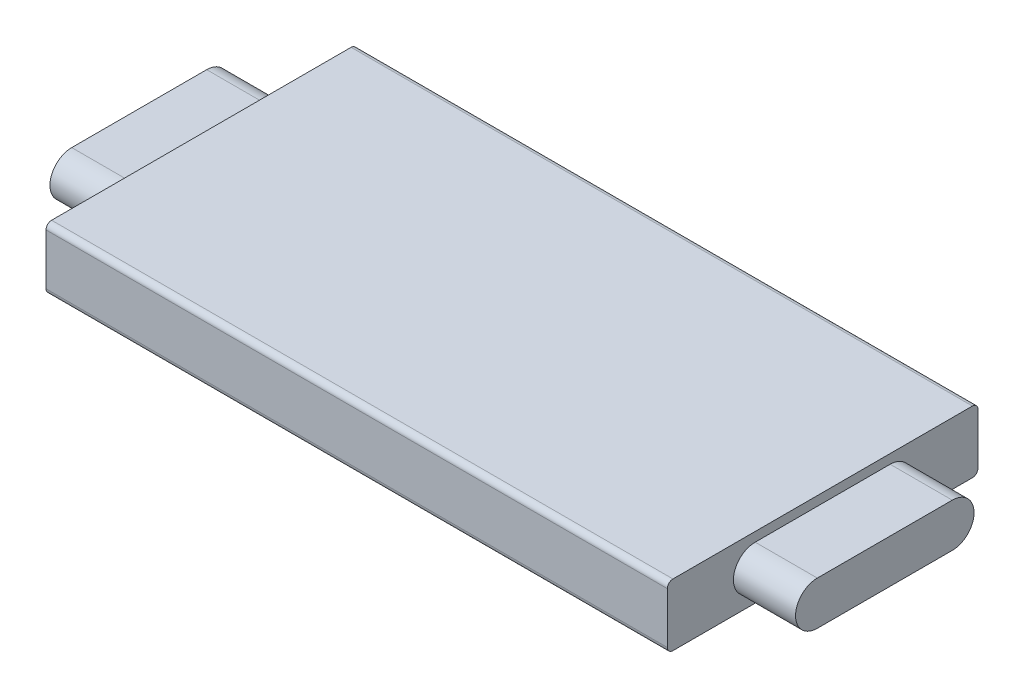
ISO-10303-21;
HEADER;
FILE_DESCRIPTION(('STEP AP214'),'2;1');
FILE_NAME('part.step','',(''),(''),'','','');
FILE_SCHEMA(('AUTOMOTIVE_DESIGN { 1 0 10303 214 1 1 1 1 }'));
ENDSEC;
DATA;
#1=APPLICATION_CONTEXT('core data for automotive mechanical design processes');
#2=APPLICATION_PROTOCOL_DEFINITION('international standard','automotive_design',2000,#1);
#3=PRODUCT_CONTEXT('',#1,'mechanical');
#4=PRODUCT('Part','Part','',(#3));
#5=PRODUCT_RELATED_PRODUCT_CATEGORY('part','',(#4));
#6=PRODUCT_DEFINITION_FORMATION('','',#4);
#7=PRODUCT_DEFINITION_CONTEXT('part definition',#1,'design');
#8=PRODUCT_DEFINITION('design','',#6,#7);
#9=PRODUCT_DEFINITION_SHAPE('','',#8);
#10=(LENGTH_UNIT() NAMED_UNIT(*) SI_UNIT(.MILLI.,.METRE.));
#11=(NAMED_UNIT(*) PLANE_ANGLE_UNIT() SI_UNIT($,.RADIAN.));
#12=(NAMED_UNIT(*) SI_UNIT($,.STERADIAN.) SOLID_ANGLE_UNIT());
#13=UNCERTAINTY_MEASURE_WITH_UNIT(LENGTH_MEASURE(1.E-05),#10,'distance_accuracy_value','');
#14=(GEOMETRIC_REPRESENTATION_CONTEXT(3) GLOBAL_UNCERTAINTY_ASSIGNED_CONTEXT((#13)) GLOBAL_UNIT_ASSIGNED_CONTEXT((#10,
#11,#12)) REPRESENTATION_CONTEXT('',''));
#15=CARTESIAN_POINT('',(0.,0.,0.));
#16=DIRECTION('',(0.,0.,1.));
#17=DIRECTION('',(1.,0.,0.));
#18=AXIS2_PLACEMENT_3D('',#15,#16,#17);
#19=CARTESIAN_POINT('',(12.7,1.27,6.35));
#20=DIRECTION('',(-1.,0.,0.));
#21=DIRECTION('',(0.,0.,1.));
#22=AXIS2_PLACEMENT_3D('',#19,#20,#21);
#23=PLANE('',#22);
#24=DIRECTION('',(0.,0.,1.));
#25=VECTOR('',#24,1.);
#26=CARTESIAN_POINT('',(12.7,-0.890155408524717,6.35));
#27=LINE('',#26,#25);
#28=CARTESIAN_POINT('',(12.7,-0.890155408524717,-2.75846638002906));
#29=VERTEX_POINT('',#28);
#30=CARTESIAN_POINT('',(12.7,-0.890155408524717,2.75846638002906));
#31=VERTEX_POINT('',#30);
#32=EDGE_CURVE('E218',#29,#31,#27,.T.);
#33=ORIENTED_EDGE('',*,*,#32,.T.);
#34=CARTESIAN_POINT('',(12.7,0.,2.75846638002906));
#35=DIRECTION('',(-1.,0.,0.));
#36=DIRECTION('',(0.,0.,1.));
#37=AXIS2_PLACEMENT_3D('',#34,#35,#36);
#38=CIRCLE('',#37,0.890155408524717);
#39=CARTESIAN_POINT('',(12.7,0.890155408524717,2.75846638002906));
#40=VERTEX_POINT('',#39);
#41=EDGE_CURVE('E229',#31,#40,#38,.T.);
#42=ORIENTED_EDGE('',*,*,#41,.T.);
#43=DIRECTION('',(0.,0.,-1.));
#44=VECTOR('',#43,1.);
#45=CARTESIAN_POINT('',(12.7,0.890155408524717,6.35));
#46=LINE('',#45,#44);
#47=CARTESIAN_POINT('',(12.7,0.890155408524717,-2.75846638002906));
#48=VERTEX_POINT('',#47);
#49=EDGE_CURVE('E223',#40,#48,#46,.T.);
#50=ORIENTED_EDGE('',*,*,#49,.T.);
#51=CARTESIAN_POINT('',(12.7,0.,-2.75846638002906));
#52=DIRECTION('',(-1.,0.,0.));
#53=DIRECTION('',(0.,0.,1.));
#54=AXIS2_PLACEMENT_3D('',#51,#52,#53);
#55=CIRCLE('',#54,0.890155408524717);
#56=EDGE_CURVE('E169',#48,#29,#55,.T.);
#57=ORIENTED_EDGE('',*,*,#56,.T.);
#58=EDGE_LOOP('',(#33,#42,#50,#57));
#59=FACE_BOUND('',#58,.T.);
#60=DIRECTION('',(0.,0.,-1.));
#61=VECTOR('',#60,1.);
#62=CARTESIAN_POINT('',(12.7,-1.27,6.35));
#63=LINE('',#62,#61);
#64=CARTESIAN_POINT('',(12.7,-1.27,6.1214));
#65=VERTEX_POINT('',#64);
#66=CARTESIAN_POINT('',(12.7,-1.27,-6.1214));
#67=VERTEX_POINT('',#66);
#68=EDGE_CURVE('E235',#65,#67,#63,.T.);
#69=ORIENTED_EDGE('',*,*,#68,.T.);
#70=CARTESIAN_POINT('',(12.7,-1.0414,-6.1214));
#71=DIRECTION('',(-1.,0.,0.));
#72=DIRECTION('',(0.,0.,1.));
#73=AXIS2_PLACEMENT_3D('',#70,#71,#72);
#74=CIRCLE('',#73,0.2286);
#75=CARTESIAN_POINT('',(12.7,-1.0414,-6.35));
#76=VERTEX_POINT('',#75);
#77=EDGE_CURVE('E299',#67,#76,#74,.F.);
#78=ORIENTED_EDGE('',*,*,#77,.T.);
#79=DIRECTION('',(0.,-1.,0.));
#80=VECTOR('',#79,1.);
#81=CARTESIAN_POINT('',(12.7,1.27,-6.35));
#82=LINE('',#81,#80);
#83=CARTESIAN_POINT('',(12.7,1.0414,-6.35));
#84=VERTEX_POINT('',#83);
#85=EDGE_CURVE('E257',#84,#76,#82,.T.);
#86=ORIENTED_EDGE('',*,*,#85,.F.);
#87=CARTESIAN_POINT('',(12.7,1.0414,-6.1214));
#88=DIRECTION('',(-1.,0.,0.));
#89=DIRECTION('',(0.,0.,1.));
#90=AXIS2_PLACEMENT_3D('',#87,#88,#89);
#91=CIRCLE('',#90,0.2286);
#92=CARTESIAN_POINT('',(12.7,1.27,-6.1214));
#93=VERTEX_POINT('',#92);
#94=EDGE_CURVE('E293',#84,#93,#91,.F.);
#95=ORIENTED_EDGE('',*,*,#94,.T.);
#96=DIRECTION('',(0.,0.,-1.));
#97=VECTOR('',#96,1.);
#98=CARTESIAN_POINT('',(12.7,1.27,6.35));
#99=LINE('',#98,#97);
#100=CARTESIAN_POINT('',(12.7,1.27,6.1214));
#101=VERTEX_POINT('',#100);
#102=EDGE_CURVE('E234',#101,#93,#99,.T.);
#103=ORIENTED_EDGE('',*,*,#102,.F.);
#104=CARTESIAN_POINT('',(12.7,1.0414,6.1214));
#105=DIRECTION('',(-1.,0.,0.));
#106=DIRECTION('',(0.,0.,1.));
#107=AXIS2_PLACEMENT_3D('',#104,#105,#106);
#108=CIRCLE('',#107,0.2286);
#109=CARTESIAN_POINT('',(12.7,1.0414,6.35));
#110=VERTEX_POINT('',#109);
#111=EDGE_CURVE('E286',#101,#110,#108,.F.);
#112=ORIENTED_EDGE('',*,*,#111,.T.);
#113=DIRECTION('',(0.,-1.,0.));
#114=VECTOR('',#113,1.);
#115=CARTESIAN_POINT('',(12.7,1.27,6.35));
#116=LINE('',#115,#114);
#117=CARTESIAN_POINT('',(12.7,-1.0414,6.35));
#118=VERTEX_POINT('',#117);
#119=EDGE_CURVE('E242',#110,#118,#116,.T.);
#120=ORIENTED_EDGE('',*,*,#119,.T.);
#121=CARTESIAN_POINT('',(12.7,-1.0414,6.1214));
#122=DIRECTION('',(-1.,0.,0.));
#123=DIRECTION('',(0.,0.,1.));
#124=AXIS2_PLACEMENT_3D('',#121,#122,#123);
#125=CIRCLE('',#124,0.2286);
#126=EDGE_CURVE('E295',#118,#65,#125,.F.);
#127=ORIENTED_EDGE('',*,*,#126,.T.);
#128=EDGE_LOOP('',(#69,#78,#86,#95,#103,#112,#120,#127));
#129=FACE_BOUND('',#128,.T.);
#130=ADVANCED_FACE('F50',(#59,#129),#23,.F.);
#131=CARTESIAN_POINT('',(-12.7,1.27,-6.35));
#132=DIRECTION('',(0.,0.,1.));
#133=DIRECTION('',(1.,0.,0.));
#134=AXIS2_PLACEMENT_3D('',#131,#132,#133);
#135=PLANE('',#134);
#136=ORIENTED_EDGE('',*,*,#85,.T.);
#137=DIRECTION('',(-1.,0.,0.));
#138=VECTOR('',#137,1.);
#139=CARTESIAN_POINT('',(-12.7,-1.0414,-6.35));
#140=LINE('',#139,#138);
#141=CARTESIAN_POINT('',(-12.7,-1.0414,-6.35));
#142=VERTEX_POINT('',#141);
#143=EDGE_CURVE('E270',#76,#142,#140,.T.);
#144=ORIENTED_EDGE('',*,*,#143,.T.);
#145=DIRECTION('',(0.,-1.,0.));
#146=VECTOR('',#145,1.);
#147=CARTESIAN_POINT('',(-12.7,1.27,-6.35));
#148=LINE('',#147,#146);
#149=CARTESIAN_POINT('',(-12.7,1.0414,-6.35));
#150=VERTEX_POINT('',#149);
#151=EDGE_CURVE('E258',#150,#142,#148,.T.);
#152=ORIENTED_EDGE('',*,*,#151,.F.);
#153=DIRECTION('',(-1.,0.,0.));
#154=VECTOR('',#153,1.);
#155=CARTESIAN_POINT('',(-12.7,1.0414,-6.35));
#156=LINE('',#155,#154);
#157=EDGE_CURVE('E262',#150,#84,#156,.F.);
#158=ORIENTED_EDGE('',*,*,#157,.T.);
#159=EDGE_LOOP('',(#136,#144,#152,#158));
#160=FACE_BOUND('',#159,.T.);
#161=ADVANCED_FACE('F355',(#160),#135,.F.);
#162=CARTESIAN_POINT('',(-12.7,1.27,6.35));
#163=DIRECTION('',(1.,0.,0.));
#164=DIRECTION('',(0.,0.,-1.));
#165=AXIS2_PLACEMENT_3D('',#162,#163,#164);
#166=PLANE('',#165);
#167=DIRECTION('',(0.,0.,1.));
#168=VECTOR('',#167,1.);
#169=CARTESIAN_POINT('',(-12.7,0.890155408524717,6.35));
#170=LINE('',#169,#168);
#171=CARTESIAN_POINT('',(-12.7,0.890155408524717,-2.75846638002906));
#172=VERTEX_POINT('',#171);
#173=CARTESIAN_POINT('',(-12.7,0.890155408524717,2.75846638002906));
#174=VERTEX_POINT('',#173);
#175=EDGE_CURVE('E57',#172,#174,#170,.T.);
#176=ORIENTED_EDGE('',*,*,#175,.T.);
#177=CARTESIAN_POINT('',(-12.7,0.,2.75846638002906));
#178=DIRECTION('',(1.,0.,0.));
#179=DIRECTION('',(0.,0.,-1.));
#180=AXIS2_PLACEMENT_3D('',#177,#178,#179);
#181=CIRCLE('',#180,0.890155408524717);
#182=CARTESIAN_POINT('',(-12.7,-0.890155408524717,2.75846638002906));
#183=VERTEX_POINT('',#182);
#184=EDGE_CURVE('E12',#174,#183,#181,.T.);
#185=ORIENTED_EDGE('',*,*,#184,.T.);
#186=DIRECTION('',(0.,0.,-1.));
#187=VECTOR('',#186,1.);
#188=CARTESIAN_POINT('',(-12.7,-0.890155408524717,6.35));
#189=LINE('',#188,#187);
#190=CARTESIAN_POINT('',(-12.7,-0.890155408524717,-2.75846638002906));
#191=VERTEX_POINT('',#190);
#192=EDGE_CURVE('E316',#183,#191,#189,.T.);
#193=ORIENTED_EDGE('',*,*,#192,.T.);
#194=CARTESIAN_POINT('',(-12.7,0.,-2.75846638002906));
#195=DIRECTION('',(1.,0.,0.));
#196=DIRECTION('',(0.,0.,-1.));
#197=AXIS2_PLACEMENT_3D('',#194,#195,#196);
#198=CIRCLE('',#197,0.890155408524717);
#199=EDGE_CURVE('E319',#191,#172,#198,.T.);
#200=ORIENTED_EDGE('',*,*,#199,.T.);
#201=EDGE_LOOP('',(#176,#185,#193,#200));
#202=FACE_BOUND('',#201,.T.);
#203=ORIENTED_EDGE('',*,*,#151,.T.);
#204=CARTESIAN_POINT('',(-12.7,-1.0414,-6.1214));
#205=DIRECTION('',(1.,0.,0.));
#206=DIRECTION('',(0.,0.,-1.));
#207=AXIS2_PLACEMENT_3D('',#204,#205,#206);
#208=CIRCLE('',#207,0.2286);
#209=CARTESIAN_POINT('',(-12.7,-1.27,-6.1214));
#210=VERTEX_POINT('',#209);
#211=EDGE_CURVE('E278',#142,#210,#208,.F.);
#212=ORIENTED_EDGE('',*,*,#211,.T.);
#213=DIRECTION('',(0.,0.,1.));
#214=VECTOR('',#213,1.);
#215=CARTESIAN_POINT('',(-12.7,-1.27,6.35));
#216=LINE('',#215,#214);
#217=CARTESIAN_POINT('',(-12.7,-1.27,6.1214));
#218=VERTEX_POINT('',#217);
#219=EDGE_CURVE('E236',#210,#218,#216,.T.);
#220=ORIENTED_EDGE('',*,*,#219,.T.);
#221=CARTESIAN_POINT('',(-12.7,-1.0414,6.1214));
#222=DIRECTION('',(1.,0.,0.));
#223=DIRECTION('',(0.,0.,-1.));
#224=AXIS2_PLACEMENT_3D('',#221,#222,#223);
#225=CIRCLE('',#224,0.2286);
#226=CARTESIAN_POINT('',(-12.7,-1.0414,6.35));
#227=VERTEX_POINT('',#226);
#228=EDGE_CURVE('E273',#218,#227,#225,.F.);
#229=ORIENTED_EDGE('',*,*,#228,.T.);
#230=DIRECTION('',(0.,-1.,0.));
#231=VECTOR('',#230,1.);
#232=CARTESIAN_POINT('',(-12.7,1.27,6.35));
#233=LINE('',#232,#231);
#234=CARTESIAN_POINT('',(-12.7,1.0414,6.35));
#235=VERTEX_POINT('',#234);
#236=EDGE_CURVE('E252',#235,#227,#233,.T.);
#237=ORIENTED_EDGE('',*,*,#236,.F.);
#238=CARTESIAN_POINT('',(-12.7,1.0414,6.1214));
#239=DIRECTION('',(1.,0.,0.));
#240=DIRECTION('',(0.,0.,-1.));
#241=AXIS2_PLACEMENT_3D('',#238,#239,#240);
#242=CIRCLE('',#241,0.2286);
#243=CARTESIAN_POINT('',(-12.7,1.27,6.1214));
#244=VERTEX_POINT('',#243);
#245=EDGE_CURVE('E271',#235,#244,#242,.F.);
#246=ORIENTED_EDGE('',*,*,#245,.T.);
#247=DIRECTION('',(0.,0.,1.));
#248=VECTOR('',#247,1.);
#249=CARTESIAN_POINT('',(-12.7,1.27,6.35));
#250=LINE('',#249,#248);
#251=CARTESIAN_POINT('',(-12.7,1.27,-6.1214));
#252=VERTEX_POINT('',#251);
#253=EDGE_CURVE('E240',#252,#244,#250,.T.);
#254=ORIENTED_EDGE('',*,*,#253,.F.);
#255=CARTESIAN_POINT('',(-12.7,1.0414,-6.1214));
#256=DIRECTION('',(1.,0.,0.));
#257=DIRECTION('',(0.,0.,-1.));
#258=AXIS2_PLACEMENT_3D('',#255,#256,#257);
#259=CIRCLE('',#258,0.2286);
#260=EDGE_CURVE('E280',#252,#150,#259,.F.);
#261=ORIENTED_EDGE('',*,*,#260,.T.);
#262=EDGE_LOOP('',(#203,#212,#220,#229,#237,#246,#254,#261));
#263=FACE_BOUND('',#262,.T.);
#264=ADVANCED_FACE('F326',(#202,#263),#166,.F.);
#265=CARTESIAN_POINT('',(-12.7,1.27,6.35));
#266=DIRECTION('',(0.,0.,-1.));
#267=DIRECTION('',(-1.,0.,0.));
#268=AXIS2_PLACEMENT_3D('',#265,#266,#267);
#269=PLANE('',#268);
#270=ORIENTED_EDGE('',*,*,#236,.T.);
#271=DIRECTION('',(1.,0.,0.));
#272=VECTOR('',#271,1.);
#273=CARTESIAN_POINT('',(12.7,-1.0414,6.35));
#274=LINE('',#273,#272);
#275=EDGE_CURVE('E315',#227,#118,#274,.T.);
#276=ORIENTED_EDGE('',*,*,#275,.T.);
#277=ORIENTED_EDGE('',*,*,#119,.F.);
#278=DIRECTION('',(1.,0.,0.));
#279=VECTOR('',#278,1.);
#280=CARTESIAN_POINT('',(-12.7,1.0414,6.35));
#281=LINE('',#280,#279);
#282=EDGE_CURVE('E310',#110,#235,#281,.F.);
#283=ORIENTED_EDGE('',*,*,#282,.T.);
#284=EDGE_LOOP('',(#270,#276,#277,#283));
#285=FACE_BOUND('',#284,.T.);
#286=ADVANCED_FACE('F386',(#285),#269,.F.);
#287=CARTESIAN_POINT('',(0.,1.27,0.));
#288=DIRECTION('',(0.,-1.,0.));
#289=DIRECTION('',(0.,0.,-1.));
#290=AXIS2_PLACEMENT_3D('',#287,#288,#289);
#291=PLANE('',#290);
#292=ORIENTED_EDGE('',*,*,#102,.T.);
#293=DIRECTION('',(-1.,0.,0.));
#294=VECTOR('',#293,1.);
#295=CARTESIAN_POINT('',(0.,1.27,-6.1214));
#296=LINE('',#295,#294);
#297=EDGE_CURVE('E303',#93,#252,#296,.T.);
#298=ORIENTED_EDGE('',*,*,#297,.T.);
#299=ORIENTED_EDGE('',*,*,#253,.T.);
#300=DIRECTION('',(1.,0.,0.));
#301=VECTOR('',#300,1.);
#302=CARTESIAN_POINT('',(0.,1.27,6.1214));
#303=LINE('',#302,#301);
#304=EDGE_CURVE('E302',#244,#101,#303,.T.);
#305=ORIENTED_EDGE('',*,*,#304,.T.);
#306=EDGE_LOOP('',(#292,#298,#299,#305));
#307=FACE_BOUND('',#306,.T.);
#308=ADVANCED_FACE('F395',(#307),#291,.F.);
#309=CARTESIAN_POINT('',(0.,-1.27,0.));
#310=DIRECTION('',(0.,-1.,0.));
#311=DIRECTION('',(0.,0.,-1.));
#312=AXIS2_PLACEMENT_3D('',#309,#310,#311);
#313=PLANE('',#312);
#314=ORIENTED_EDGE('',*,*,#219,.F.);
#315=DIRECTION('',(-1.,0.,0.));
#316=VECTOR('',#315,1.);
#317=CARTESIAN_POINT('',(12.7,-1.27,-6.1214));
#318=LINE('',#317,#316);
#319=EDGE_CURVE('E287',#210,#67,#318,.F.);
#320=ORIENTED_EDGE('',*,*,#319,.T.);
#321=ORIENTED_EDGE('',*,*,#68,.F.);
#322=DIRECTION('',(1.,0.,0.));
#323=VECTOR('',#322,1.);
#324=CARTESIAN_POINT('',(-12.7,-1.27,6.1214));
#325=LINE('',#324,#323);
#326=EDGE_CURVE('E284',#65,#218,#325,.F.);
#327=ORIENTED_EDGE('',*,*,#326,.T.);
#328=EDGE_LOOP('',(#314,#320,#321,#327));
#329=FACE_BOUND('',#328,.T.);
#330=ADVANCED_FACE('F375',(#329),#313,.T.);
#331=CARTESIAN_POINT('',(-12.7,-1.0414,-6.1214));
#332=DIRECTION('',(1.,0.,0.));
#333=DIRECTION('',(0.,0.,-1.));
#334=AXIS2_PLACEMENT_3D('',#331,#332,#333);
#335=CYLINDRICAL_SURFACE('',#334,0.2286);
#336=ORIENTED_EDGE('',*,*,#77,.F.);
#337=ORIENTED_EDGE('',*,*,#319,.F.);
#338=ORIENTED_EDGE('',*,*,#211,.F.);
#339=ORIENTED_EDGE('',*,*,#143,.F.);
#340=EDGE_LOOP('',(#336,#337,#338,#339));
#341=FACE_BOUND('',#340,.T.);
#342=ADVANCED_FACE('F366',(#341),#335,.T.);
#343=CARTESIAN_POINT('',(0.,1.0414,-6.1214));
#344=DIRECTION('',(-1.,0.,0.));
#345=DIRECTION('',(0.,0.,1.));
#346=AXIS2_PLACEMENT_3D('',#343,#344,#345);
#347=CYLINDRICAL_SURFACE('',#346,0.2286);
#348=ORIENTED_EDGE('',*,*,#94,.F.);
#349=ORIENTED_EDGE('',*,*,#157,.F.);
#350=ORIENTED_EDGE('',*,*,#260,.F.);
#351=ORIENTED_EDGE('',*,*,#297,.F.);
#352=EDGE_LOOP('',(#348,#349,#350,#351));
#353=FACE_BOUND('',#352,.T.);
#354=ADVANCED_FACE('F371',(#353),#347,.T.);
#355=CARTESIAN_POINT('',(-12.7,-1.0414,6.1214));
#356=DIRECTION('',(-1.,0.,0.));
#357=DIRECTION('',(0.,0.,1.));
#358=AXIS2_PLACEMENT_3D('',#355,#356,#357);
#359=CYLINDRICAL_SURFACE('',#358,0.2286);
#360=ORIENTED_EDGE('',*,*,#228,.F.);
#361=ORIENTED_EDGE('',*,*,#326,.F.);
#362=ORIENTED_EDGE('',*,*,#126,.F.);
#363=ORIENTED_EDGE('',*,*,#275,.F.);
#364=EDGE_LOOP('',(#360,#361,#362,#363));
#365=FACE_BOUND('',#364,.T.);
#366=ADVANCED_FACE('F374',(#365),#359,.T.);
#367=CARTESIAN_POINT('',(0.,1.0414,6.1214));
#368=DIRECTION('',(1.,0.,0.));
#369=DIRECTION('',(0.,0.,-1.));
#370=AXIS2_PLACEMENT_3D('',#367,#368,#369);
#371=CYLINDRICAL_SURFACE('',#370,0.2286);
#372=ORIENTED_EDGE('',*,*,#245,.F.);
#373=ORIENTED_EDGE('',*,*,#282,.F.);
#374=ORIENTED_EDGE('',*,*,#111,.F.);
#375=ORIENTED_EDGE('',*,*,#304,.F.);
#376=EDGE_LOOP('',(#372,#373,#374,#375));
#377=FACE_BOUND('',#376,.T.);
#378=ADVANCED_FACE('F47',(#377),#371,.T.);
#379=CARTESIAN_POINT('',(-15.24,1.27,6.35));
#380=DIRECTION('',(1.,0.,0.));
#381=DIRECTION('',(0.,0.,-1.));
#382=AXIS2_PLACEMENT_3D('',#379,#380,#381);
#383=PLANE('',#382);
#384=CARTESIAN_POINT('',(-15.24,0.,2.75846638002906));
#385=DIRECTION('',(1.,0.,0.));
#386=DIRECTION('',(0.,0.,-1.));
#387=AXIS2_PLACEMENT_3D('',#384,#385,#386);
#388=CIRCLE('',#387,0.890155408524717);
#389=CARTESIAN_POINT('',(-15.24,-0.890155408524717,2.75846638002906));
#390=VERTEX_POINT('',#389);
#391=CARTESIAN_POINT('',(-15.24,0.890155408524717,2.75846638002906));
#392=VERTEX_POINT('',#391);
#393=EDGE_CURVE('E203',#390,#392,#388,.F.);
#394=ORIENTED_EDGE('',*,*,#393,.T.);
#395=DIRECTION('',(0.,0.,-1.));
#396=VECTOR('',#395,1.);
#397=CARTESIAN_POINT('',(-15.24,0.890155408524717,2.75846638002906));
#398=LINE('',#397,#396);
#399=CARTESIAN_POINT('',(-15.24,0.890155408524717,-2.75846638002906));
#400=VERTEX_POINT('',#399);
#401=EDGE_CURVE('E197',#392,#400,#398,.T.);
#402=ORIENTED_EDGE('',*,*,#401,.T.);
#403=CARTESIAN_POINT('',(-15.24,0.,-2.75846638002906));
#404=DIRECTION('',(1.,0.,0.));
#405=DIRECTION('',(0.,0.,-1.));
#406=AXIS2_PLACEMENT_3D('',#403,#404,#405);
#407=CIRCLE('',#406,0.890155408524717);
#408=CARTESIAN_POINT('',(-15.24,-0.890155408524717,-2.75846638002906));
#409=VERTEX_POINT('',#408);
#410=EDGE_CURVE('E191',#400,#409,#407,.F.);
#411=ORIENTED_EDGE('',*,*,#410,.T.);
#412=DIRECTION('',(0.,0.,1.));
#413=VECTOR('',#412,1.);
#414=CARTESIAN_POINT('',(-15.24,-0.890155408524717,2.75846638002906));
#415=LINE('',#414,#413);
#416=EDGE_CURVE('E204',#409,#390,#415,.T.);
#417=ORIENTED_EDGE('',*,*,#416,.T.);
#418=EDGE_LOOP('',(#394,#402,#411,#417));
#419=FACE_BOUND('',#418,.T.);
#420=ADVANCED_FACE('F337',(#419),#383,.F.);
#421=CARTESIAN_POINT('',(-25.2912762183893,-0.890155408524717,2.75846638002906));
#422=DIRECTION('',(0.,-1.,0.));
#423=DIRECTION('',(0.,0.,-1.));
#424=AXIS2_PLACEMENT_3D('',#421,#422,#423);
#425=PLANE('',#424);
#426=ORIENTED_EDGE('',*,*,#192,.F.);
#427=DIRECTION('',(1.,0.,0.));
#428=VECTOR('',#427,1.);
#429=CARTESIAN_POINT('',(-25.2912762183893,-0.890155408524717,2.75846638002906));
#430=LINE('',#429,#428);
#431=EDGE_CURVE('E213',#390,#183,#430,.T.);
#432=ORIENTED_EDGE('',*,*,#431,.F.);
#433=ORIENTED_EDGE('',*,*,#416,.F.);
#434=DIRECTION('',(1.,0.,0.));
#435=VECTOR('',#434,1.);
#436=CARTESIAN_POINT('',(-25.2912762183893,-0.890155408524717,-2.75846638002906));
#437=LINE('',#436,#435);
#438=EDGE_CURVE('E72',#409,#191,#437,.T.);
#439=ORIENTED_EDGE('',*,*,#438,.T.);
#440=EDGE_LOOP('',(#426,#432,#433,#439));
#441=FACE_BOUND('',#440,.T.);
#442=ADVANCED_FACE('F345',(#441),#425,.T.);
#443=CARTESIAN_POINT('',(-25.2912762183893,0.,-2.75846638002906));
#444=DIRECTION('',(1.,0.,0.));
#445=DIRECTION('',(0.,0.,-1.));
#446=AXIS2_PLACEMENT_3D('',#443,#444,#445);
#447=CYLINDRICAL_SURFACE('',#446,0.890155408524717);
#448=ORIENTED_EDGE('',*,*,#199,.F.);
#449=ORIENTED_EDGE('',*,*,#438,.F.);
#450=ORIENTED_EDGE('',*,*,#410,.F.);
#451=DIRECTION('',(1.,0.,0.));
#452=VECTOR('',#451,1.);
#453=CARTESIAN_POINT('',(-25.2912762183893,0.890155408524717,-2.75846638002906));
#454=LINE('',#453,#452);
#455=EDGE_CURVE('E174',#400,#172,#454,.T.);
#456=ORIENTED_EDGE('',*,*,#455,.T.);
#457=EDGE_LOOP('',(#448,#449,#450,#456));
#458=FACE_BOUND('',#457,.T.);
#459=ADVANCED_FACE('F333',(#458),#447,.T.);
#460=CARTESIAN_POINT('',(-25.2912762183893,0.890155408524717,2.75846638002906));
#461=DIRECTION('',(0.,1.,0.));
#462=DIRECTION('',(0.,0.,1.));
#463=AXIS2_PLACEMENT_3D('',#460,#461,#462);
#464=PLANE('',#463);
#465=ORIENTED_EDGE('',*,*,#175,.F.);
#466=ORIENTED_EDGE('',*,*,#455,.F.);
#467=ORIENTED_EDGE('',*,*,#401,.F.);
#468=DIRECTION('',(1.,0.,0.));
#469=VECTOR('',#468,1.);
#470=CARTESIAN_POINT('',(-25.2912762183893,0.890155408524717,2.75846638002906));
#471=LINE('',#470,#469);
#472=EDGE_CURVE('E196',#392,#174,#471,.T.);
#473=ORIENTED_EDGE('',*,*,#472,.T.);
#474=EDGE_LOOP('',(#465,#466,#467,#473));
#475=FACE_BOUND('',#474,.T.);
#476=ADVANCED_FACE('F329',(#475),#464,.T.);
#477=CARTESIAN_POINT('',(-25.2912762183893,0.,2.75846638002906));
#478=DIRECTION('',(1.,0.,0.));
#479=DIRECTION('',(0.,0.,-1.));
#480=AXIS2_PLACEMENT_3D('',#477,#478,#479);
#481=CYLINDRICAL_SURFACE('',#480,0.890155408524717);
#482=ORIENTED_EDGE('',*,*,#184,.F.);
#483=ORIENTED_EDGE('',*,*,#472,.F.);
#484=ORIENTED_EDGE('',*,*,#393,.F.);
#485=ORIENTED_EDGE('',*,*,#431,.T.);
#486=EDGE_LOOP('',(#482,#483,#484,#485));
#487=FACE_BOUND('',#486,.T.);
#488=ADVANCED_FACE('F340',(#487),#481,.T.);
#489=ORIENTED_EDGE('',*,*,#41,.F.);
#490=CARTESIAN_POINT('',(15.24,-0.890155408524717,2.75846638002906));
#491=VERTEX_POINT('',#490);
#492=EDGE_CURVE('E64',#31,#491,#430,.T.);
#493=ORIENTED_EDGE('',*,*,#492,.T.);
#494=CARTESIAN_POINT('',(15.24,0.,2.75846638002906));
#495=DIRECTION('',(-1.,0.,0.));
#496=DIRECTION('',(0.,0.,1.));
#497=AXIS2_PLACEMENT_3D('',#494,#495,#496);
#498=CIRCLE('',#497,0.890155408524717);
#499=CARTESIAN_POINT('',(15.24,0.890155408524717,2.75846638002906));
#500=VERTEX_POINT('',#499);
#501=EDGE_CURVE('E195',#491,#500,#498,.T.);
#502=ORIENTED_EDGE('',*,*,#501,.T.);
#503=EDGE_CURVE('E187',#40,#500,#471,.T.);
#504=ORIENTED_EDGE('',*,*,#503,.F.);
#505=EDGE_LOOP('',(#489,#493,#502,#504));
#506=FACE_BOUND('',#505,.T.);
#507=ADVANCED_FACE('F457',(#506),#481,.T.);
#508=ORIENTED_EDGE('',*,*,#49,.F.);
#509=ORIENTED_EDGE('',*,*,#503,.T.);
#510=DIRECTION('',(0.,0.,-1.));
#511=VECTOR('',#510,1.);
#512=CARTESIAN_POINT('',(15.24,0.890155408524717,2.75846638002906));
#513=LINE('',#512,#511);
#514=CARTESIAN_POINT('',(15.24,0.890155408524717,-2.75846638002906));
#515=VERTEX_POINT('',#514);
#516=EDGE_CURVE('E178',#500,#515,#513,.T.);
#517=ORIENTED_EDGE('',*,*,#516,.T.);
#518=EDGE_CURVE('E165',#48,#515,#454,.T.);
#519=ORIENTED_EDGE('',*,*,#518,.F.);
#520=EDGE_LOOP('',(#508,#509,#517,#519));
#521=FACE_BOUND('',#520,.T.);
#522=ADVANCED_FACE('F183',(#521),#464,.T.);
#523=ORIENTED_EDGE('',*,*,#56,.F.);
#524=ORIENTED_EDGE('',*,*,#518,.T.);
#525=CARTESIAN_POINT('',(15.24,0.,-2.75846638002906));
#526=DIRECTION('',(-1.,0.,0.));
#527=DIRECTION('',(0.,0.,1.));
#528=AXIS2_PLACEMENT_3D('',#525,#526,#527);
#529=CIRCLE('',#528,0.890155408524717);
#530=CARTESIAN_POINT('',(15.24,-0.890155408524717,-2.75846638002906));
#531=VERTEX_POINT('',#530);
#532=EDGE_CURVE('E167',#515,#531,#529,.T.);
#533=ORIENTED_EDGE('',*,*,#532,.T.);
#534=EDGE_CURVE('E215',#29,#531,#437,.T.);
#535=ORIENTED_EDGE('',*,*,#534,.F.);
#536=EDGE_LOOP('',(#523,#524,#533,#535));
#537=FACE_BOUND('',#536,.T.);
#538=ADVANCED_FACE('F163',(#537),#447,.T.);
#539=ORIENTED_EDGE('',*,*,#32,.F.);
#540=ORIENTED_EDGE('',*,*,#534,.T.);
#541=DIRECTION('',(0.,0.,1.));
#542=VECTOR('',#541,1.);
#543=CARTESIAN_POINT('',(15.24,-0.890155408524717,2.75846638002906));
#544=LINE('',#543,#542);
#545=EDGE_CURVE('E185',#531,#491,#544,.T.);
#546=ORIENTED_EDGE('',*,*,#545,.T.);
#547=ORIENTED_EDGE('',*,*,#492,.F.);
#548=EDGE_LOOP('',(#539,#540,#546,#547));
#549=FACE_BOUND('',#548,.T.);
#550=ADVANCED_FACE('F343',(#549),#425,.T.);
#551=CARTESIAN_POINT('',(15.24,1.27,6.35));
#552=DIRECTION('',(-1.,0.,0.));
#553=DIRECTION('',(0.,0.,1.));
#554=AXIS2_PLACEMENT_3D('',#551,#552,#553);
#555=PLANE('',#554);
#556=ORIENTED_EDGE('',*,*,#545,.F.);
#557=ORIENTED_EDGE('',*,*,#532,.F.);
#558=ORIENTED_EDGE('',*,*,#516,.F.);
#559=ORIENTED_EDGE('',*,*,#501,.F.);
#560=EDGE_LOOP('',(#556,#557,#558,#559));
#561=FACE_BOUND('',#560,.T.);
#562=ADVANCED_FACE('F179',(#561),#555,.F.);
#563=CLOSED_SHELL('',(#130,#161,#264,#286,#308,#330,#342,#354,#366,#378,#420,#442,#459,#476,
#488,#507,#522,#538,#550,#562));
#564=MANIFOLD_SOLID_BREP('B2',#563);
#565=ADVANCED_BREP_SHAPE_REPRESENTATION('',(#18,#564),#14);
#566=SHAPE_DEFINITION_REPRESENTATION(#9,#565);
ENDSEC;
END-ISO-10303-21;
